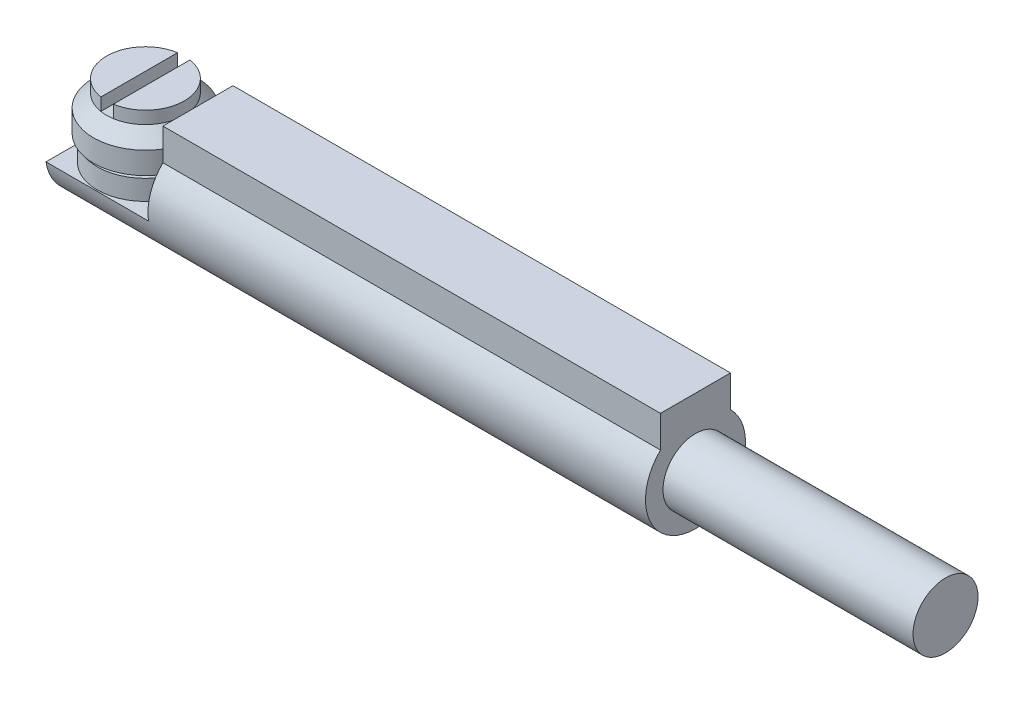
ISO-10303-21;
HEADER;
FILE_DESCRIPTION(('STEP AP214'),'2;1');
FILE_NAME('part.step','',(''),(''),'','','');
FILE_SCHEMA(('AUTOMOTIVE_DESIGN { 1 0 10303 214 1 1 1 1 }'));
ENDSEC;
DATA;
#1=APPLICATION_CONTEXT('core data for automotive mechanical design processes');
#2=APPLICATION_PROTOCOL_DEFINITION('international standard','automotive_design',2000,#1);
#3=PRODUCT_CONTEXT('',#1,'mechanical');
#4=PRODUCT('Part','Part','',(#3));
#5=PRODUCT_RELATED_PRODUCT_CATEGORY('part','',(#4));
#6=PRODUCT_DEFINITION_FORMATION('','',#4);
#7=PRODUCT_DEFINITION_CONTEXT('part definition',#1,'design');
#8=PRODUCT_DEFINITION('design','',#6,#7);
#9=PRODUCT_DEFINITION_SHAPE('','',#8);
#10=(LENGTH_UNIT() NAMED_UNIT(*) SI_UNIT(.MILLI.,.METRE.));
#11=(NAMED_UNIT(*) PLANE_ANGLE_UNIT() SI_UNIT($,.RADIAN.));
#12=(NAMED_UNIT(*) SI_UNIT($,.STERADIAN.) SOLID_ANGLE_UNIT());
#13=UNCERTAINTY_MEASURE_WITH_UNIT(LENGTH_MEASURE(1.E-05),#10,'distance_accuracy_value','');
#14=(GEOMETRIC_REPRESENTATION_CONTEXT(3) GLOBAL_UNCERTAINTY_ASSIGNED_CONTEXT((#13)) GLOBAL_UNIT_ASSIGNED_CONTEXT((#10,
#11,#12)) REPRESENTATION_CONTEXT('',''));
#15=CARTESIAN_POINT('',(0.,0.,0.));
#16=DIRECTION('',(0.,0.,1.));
#17=DIRECTION('',(1.,0.,0.));
#18=AXIS2_PLACEMENT_3D('',#15,#16,#17);
#19=CARTESIAN_POINT('',(24.,0.,0.));
#20=DIRECTION('',(1.,0.,0.));
#21=DIRECTION('',(0.,0.,-1.));
#22=AXIS2_PLACEMENT_3D('',#19,#20,#21);
#23=PLANE('',#22);
#24=CARTESIAN_POINT('',(24.,0.,0.));
#25=DIRECTION('',(1.,0.,0.));
#26=DIRECTION('',(0.,0.,-1.));
#27=AXIS2_PLACEMENT_3D('',#24,#25,#26);
#28=CIRCLE('',#27,2.);
#29=CARTESIAN_POINT('',(24.,1.42828568570857,1.4));
#30=VERTEX_POINT('',#29);
#31=CARTESIAN_POINT('',(24.,1.42828568570857,-1.4));
#32=VERTEX_POINT('',#31);
#33=EDGE_CURVE('E160',#30,#32,#28,.T.);
#34=ORIENTED_EDGE('',*,*,#33,.T.);
#35=DIRECTION('',(0.,1.,0.));
#36=VECTOR('',#35,1.);
#37=CARTESIAN_POINT('',(24.,2.7,-1.4));
#38=LINE('',#37,#36);
#39=CARTESIAN_POINT('',(24.,2.7,-1.4));
#40=VERTEX_POINT('',#39);
#41=EDGE_CURVE('E163',#32,#40,#38,.T.);
#42=ORIENTED_EDGE('',*,*,#41,.T.);
#43=DIRECTION('',(0.,0.,1.));
#44=VECTOR('',#43,1.);
#45=CARTESIAN_POINT('',(24.,2.7,1.4));
#46=LINE('',#45,#44);
#47=CARTESIAN_POINT('',(24.,2.7,1.4));
#48=VERTEX_POINT('',#47);
#49=EDGE_CURVE('E166',#40,#48,#46,.T.);
#50=ORIENTED_EDGE('',*,*,#49,.T.);
#51=DIRECTION('',(0.,-1.,0.));
#52=VECTOR('',#51,1.);
#53=CARTESIAN_POINT('',(24.,2.7,1.4));
#54=LINE('',#53,#52);
#55=EDGE_CURVE('E168',#48,#30,#54,.T.);
#56=ORIENTED_EDGE('',*,*,#55,.T.);
#57=EDGE_LOOP('',(#34,#42,#50,#56));
#58=FACE_BOUND('',#57,.T.);
#59=CARTESIAN_POINT('',(24.,0.,0.));
#60=DIRECTION('',(1.,0.,0.));
#61=DIRECTION('',(0.,0.,-1.));
#62=AXIS2_PLACEMENT_3D('',#59,#60,#61);
#63=CIRCLE('',#62,1.3);
#64=CARTESIAN_POINT('',(24.,0.,-1.3));
#65=VERTEX_POINT('',#64);
#66=EDGE_CURVE('E293',#65,#65,#63,.T.);
#67=ORIENTED_EDGE('',*,*,#66,.F.);
#68=EDGE_LOOP('',(#67));
#69=FACE_BOUND('',#68,.T.);
#70=ADVANCED_FACE('F32',(#58,#69),#23,.T.);
#71=CARTESIAN_POINT('',(2.,2.59999899999999,0.));
#72=DIRECTION('',(0.,1.,0.));
#73=DIRECTION('',(-1.,0.,0.));
#74=AXIS2_PLACEMENT_3D('',#71,#72,#73);
#75=PLANE('',#74);
#76=DIRECTION('',(0.,0.,-1.));
#77=VECTOR('',#76,1.);
#78=CARTESIAN_POINT('',(2.25,2.59999899999999,-2.5));
#79=LINE('',#78,#77);
#80=CARTESIAN_POINT('',(2.25,2.59999899999999,1.53477197003333));
#81=VERTEX_POINT('',#80);
#82=CARTESIAN_POINT('',(2.25,2.59999899999999,-1.53477197003333));
#83=VERTEX_POINT('',#82);
#84=EDGE_CURVE('E292',#81,#83,#79,.T.);
#85=ORIENTED_EDGE('',*,*,#84,.F.);
#86=CARTESIAN_POINT('',(2.,2.59999899999999,0.));
#87=DIRECTION('',(0.,1.,0.));
#88=DIRECTION('',(-1.,0.,0.));
#89=AXIS2_PLACEMENT_3D('',#86,#87,#88);
#90=CIRCLE('',#89,1.555);
#91=EDGE_CURVE('E135',#81,#83,#90,.T.);
#92=ORIENTED_EDGE('',*,*,#91,.T.);
#93=EDGE_LOOP('',(#85,#92));
#94=FACE_BOUND('',#93,.T.);
#95=ADVANCED_FACE('F216',(#94),#75,.T.);
#96=CARTESIAN_POINT('',(2.,2.59999899999999,0.));
#97=DIRECTION('',(0.,1.,0.));
#98=DIRECTION('',(-1.,0.,0.));
#99=AXIS2_PLACEMENT_3D('',#96,#97,#98);
#100=CYLINDRICAL_SURFACE('',#99,1.555);
#101=DIRECTION('',(0.,1.,0.));
#102=VECTOR('',#101,1.);
#103=CARTESIAN_POINT('',(2.25,2.59999899999999,-1.53477197003333));
#104=LINE('',#103,#102);
#105=CARTESIAN_POINT('',(2.25,2.09999899999999,-1.53477197003333));
#106=VERTEX_POINT('',#105);
#107=EDGE_CURVE('E127',#83,#106,#104,.F.);
#108=ORIENTED_EDGE('',*,*,#107,.F.);
#109=ORIENTED_EDGE('',*,*,#91,.F.);
#110=DIRECTION('',(0.,1.,0.));
#111=VECTOR('',#110,1.);
#112=CARTESIAN_POINT('',(2.25,2.59999899999999,1.53477197003333));
#113=LINE('',#112,#111);
#114=CARTESIAN_POINT('',(2.25,2.09999899999999,1.53477197003333));
#115=VERTEX_POINT('',#114);
#116=EDGE_CURVE('E124',#115,#81,#113,.T.);
#117=ORIENTED_EDGE('',*,*,#116,.F.);
#118=CARTESIAN_POINT('',(2.,2.09999899999999,0.));
#119=DIRECTION('',(0.,1.,0.));
#120=DIRECTION('',(-1.,0.,0.));
#121=AXIS2_PLACEMENT_3D('',#118,#119,#120);
#122=CIRCLE('',#121,1.555);
#123=EDGE_CURVE('E118',#115,#106,#122,.T.);
#124=ORIENTED_EDGE('',*,*,#123,.T.);
#125=EDGE_LOOP('',(#108,#109,#117,#124));
#126=FACE_BOUND('',#125,.T.);
#127=ADVANCED_FACE('F133',(#126),#100,.T.);
#128=CARTESIAN_POINT('',(0.,0.,0.));
#129=DIRECTION('',(1.,0.,0.));
#130=DIRECTION('',(0.,0.,-1.));
#131=AXIS2_PLACEMENT_3D('',#128,#129,#130);
#132=PLANE('',#131);
#133=DIRECTION('',(0.,0.,1.));
#134=VECTOR('',#133,1.);
#135=CARTESIAN_POINT('',(0.,-0.3,0.));
#136=LINE('',#135,#134);
#137=CARTESIAN_POINT('',(0.,-0.3,-1.97737199332852));
#138=VERTEX_POINT('',#137);
#139=CARTESIAN_POINT('',(0.,-0.3,1.97737199332852));
#140=VERTEX_POINT('',#139);
#141=EDGE_CURVE('E184',#138,#140,#136,.T.);
#142=ORIENTED_EDGE('',*,*,#141,.F.);
#143=CARTESIAN_POINT('',(0.,0.,0.));
#144=DIRECTION('',(1.,0.,0.));
#145=DIRECTION('',(0.,0.,-1.));
#146=AXIS2_PLACEMENT_3D('',#143,#144,#145);
#147=CIRCLE('',#146,2.);
#148=EDGE_CURVE('E164',#140,#138,#147,.T.);
#149=ORIENTED_EDGE('',*,*,#148,.F.);
#150=EDGE_LOOP('',(#142,#149));
#151=FACE_BOUND('',#150,.T.);
#152=ADVANCED_FACE('F214',(#151),#132,.F.);
#153=CARTESIAN_POINT('',(24.,0.,0.));
#154=DIRECTION('',(-1.,0.,0.));
#155=DIRECTION('',(0.,0.,1.));
#156=AXIS2_PLACEMENT_3D('',#153,#154,#155);
#157=CYLINDRICAL_SURFACE('',#156,2.);
#158=DIRECTION('',(-1.,0.,0.));
#159=VECTOR('',#158,1.);
#160=CARTESIAN_POINT('',(24.,-0.3,-1.97737199332852));
#161=LINE('',#160,#159);
#162=CARTESIAN_POINT('',(4.1,-0.3,-1.97737199332852));
#163=VERTEX_POINT('',#162);
#164=EDGE_CURVE('E55',#163,#138,#161,.T.);
#165=ORIENTED_EDGE('',*,*,#164,.F.);
#166=CARTESIAN_POINT('',(4.1,0.,0.));
#167=DIRECTION('',(1.,0.,0.));
#168=DIRECTION('',(0.,0.,-1.));
#169=AXIS2_PLACEMENT_3D('',#166,#167,#168);
#170=CIRCLE('',#169,2.);
#171=CARTESIAN_POINT('',(4.1,1.42828568570857,-1.4));
#172=VERTEX_POINT('',#171);
#173=EDGE_CURVE('E157',#163,#172,#170,.T.);
#174=ORIENTED_EDGE('',*,*,#173,.T.);
#175=DIRECTION('',(-1.,0.,0.));
#176=VECTOR('',#175,1.);
#177=CARTESIAN_POINT('',(24.,1.42828568570857,-1.4));
#178=LINE('',#177,#176);
#179=EDGE_CURVE('E181',#32,#172,#178,.T.);
#180=ORIENTED_EDGE('',*,*,#179,.F.);
#181=ORIENTED_EDGE('',*,*,#33,.F.);
#182=DIRECTION('',(-1.,0.,0.));
#183=VECTOR('',#182,1.);
#184=CARTESIAN_POINT('',(24.,1.42828568570857,1.4));
#185=LINE('',#184,#183);
#186=CARTESIAN_POINT('',(4.1,1.42828568570857,1.4));
#187=VERTEX_POINT('',#186);
#188=EDGE_CURVE('E170',#30,#187,#185,.T.);
#189=ORIENTED_EDGE('',*,*,#188,.T.);
#190=CARTESIAN_POINT('',(4.1,-0.3,1.97737199332852));
#191=VERTEX_POINT('',#190);
#192=EDGE_CURVE('E153',#187,#191,#170,.T.);
#193=ORIENTED_EDGE('',*,*,#192,.T.);
#194=DIRECTION('',(-1.,0.,0.));
#195=VECTOR('',#194,1.);
#196=CARTESIAN_POINT('',(24.,-0.3,1.97737199332852));
#197=LINE('',#196,#195);
#198=EDGE_CURVE('E148',#140,#191,#197,.F.);
#199=ORIENTED_EDGE('',*,*,#198,.F.);
#200=ORIENTED_EDGE('',*,*,#148,.T.);
#201=EDGE_LOOP('',(#165,#174,#180,#181,#189,#193,#199,#200));
#202=FACE_BOUND('',#201,.T.);
#203=ADVANCED_FACE('F34',(#202),#157,.T.);
#204=CARTESIAN_POINT('',(24.,2.7,-1.4));
#205=DIRECTION('',(0.,0.,1.));
#206=DIRECTION('',(0.,-1.,0.));
#207=AXIS2_PLACEMENT_3D('',#204,#205,#206);
#208=PLANE('',#207);
#209=ORIENTED_EDGE('',*,*,#179,.T.);
#210=DIRECTION('',(0.,1.,0.));
#211=VECTOR('',#210,1.);
#212=CARTESIAN_POINT('',(4.1,2.7,-1.4));
#213=LINE('',#212,#211);
#214=CARTESIAN_POINT('',(4.1,2.7,-1.4));
#215=VERTEX_POINT('',#214);
#216=EDGE_CURVE('E156',#172,#215,#213,.T.);
#217=ORIENTED_EDGE('',*,*,#216,.T.);
#218=DIRECTION('',(-1.,0.,0.));
#219=VECTOR('',#218,1.);
#220=CARTESIAN_POINT('',(24.,2.7,-1.4));
#221=LINE('',#220,#219);
#222=EDGE_CURVE('E178',#40,#215,#221,.T.);
#223=ORIENTED_EDGE('',*,*,#222,.F.);
#224=ORIENTED_EDGE('',*,*,#41,.F.);
#225=EDGE_LOOP('',(#209,#217,#223,#224));
#226=FACE_BOUND('',#225,.T.);
#227=ADVANCED_FACE('F207',(#226),#208,.F.);
#228=CARTESIAN_POINT('',(24.,2.7,1.4));
#229=DIRECTION('',(0.,-1.,0.));
#230=DIRECTION('',(0.,0.,-1.));
#231=AXIS2_PLACEMENT_3D('',#228,#229,#230);
#232=PLANE('',#231);
#233=ORIENTED_EDGE('',*,*,#222,.T.);
#234=DIRECTION('',(0.,0.,-1.));
#235=VECTOR('',#234,1.);
#236=CARTESIAN_POINT('',(4.1,2.7,-2.5));
#237=LINE('',#236,#235);
#238=CARTESIAN_POINT('',(4.1,2.7,1.4));
#239=VERTEX_POINT('',#238);
#240=EDGE_CURVE('E149',#239,#215,#237,.T.);
#241=ORIENTED_EDGE('',*,*,#240,.F.);
#242=DIRECTION('',(-1.,0.,0.));
#243=VECTOR('',#242,1.);
#244=CARTESIAN_POINT('',(24.,2.7,1.4));
#245=LINE('',#244,#243);
#246=EDGE_CURVE('E175',#48,#239,#245,.T.);
#247=ORIENTED_EDGE('',*,*,#246,.F.);
#248=ORIENTED_EDGE('',*,*,#49,.F.);
#249=EDGE_LOOP('',(#233,#241,#247,#248));
#250=FACE_BOUND('',#249,.T.);
#251=ADVANCED_FACE('F203',(#250),#232,.F.);
#252=CARTESIAN_POINT('',(24.,2.7,1.4));
#253=DIRECTION('',(0.,0.,-1.));
#254=DIRECTION('',(0.,1.,0.));
#255=AXIS2_PLACEMENT_3D('',#252,#253,#254);
#256=PLANE('',#255);
#257=ORIENTED_EDGE('',*,*,#246,.T.);
#258=DIRECTION('',(0.,-1.,0.));
#259=VECTOR('',#258,1.);
#260=CARTESIAN_POINT('',(4.1,2.7,1.4));
#261=LINE('',#260,#259);
#262=EDGE_CURVE('E40',#239,#187,#261,.T.);
#263=ORIENTED_EDGE('',*,*,#262,.T.);
#264=ORIENTED_EDGE('',*,*,#188,.F.);
#265=ORIENTED_EDGE('',*,*,#55,.F.);
#266=EDGE_LOOP('',(#257,#263,#264,#265));
#267=FACE_BOUND('',#266,.T.);
#268=ADVANCED_FACE('F188',(#267),#256,.F.);
#269=CARTESIAN_POINT('',(4.1,-0.3,-2.5));
#270=DIRECTION('',(1.,0.,0.));
#271=DIRECTION('',(0.,0.,-1.));
#272=AXIS2_PLACEMENT_3D('',#269,#270,#271);
#273=PLANE('',#272);
#274=DIRECTION('',(0.,0.,-1.));
#275=VECTOR('',#274,1.);
#276=CARTESIAN_POINT('',(4.1,-0.3,-2.5));
#277=LINE('',#276,#275);
#278=EDGE_CURVE('E146',#191,#163,#277,.T.);
#279=ORIENTED_EDGE('',*,*,#278,.F.);
#280=ORIENTED_EDGE('',*,*,#192,.F.);
#281=ORIENTED_EDGE('',*,*,#262,.F.);
#282=ORIENTED_EDGE('',*,*,#240,.T.);
#283=ORIENTED_EDGE('',*,*,#216,.F.);
#284=ORIENTED_EDGE('',*,*,#173,.F.);
#285=EDGE_LOOP('',(#279,#280,#281,#282,#283,#284));
#286=FACE_BOUND('',#285,.T.);
#287=ADVANCED_FACE('F205',(#286),#273,.F.);
#288=CARTESIAN_POINT('',(4.1,-0.3,2.5));
#289=DIRECTION('',(0.,1.,0.));
#290=DIRECTION('',(0.,0.,1.));
#291=AXIS2_PLACEMENT_3D('',#288,#289,#290);
#292=PLANE('',#291);
#293=CARTESIAN_POINT('',(2.,-0.3,0.));
#294=DIRECTION('',(0.,1.,0.));
#295=DIRECTION('',(0.,0.,1.));
#296=AXIS2_PLACEMENT_3D('',#293,#294,#295);
#297=CIRCLE('',#296,1.9250009999999);
#298=CARTESIAN_POINT('',(2.,-0.3,1.9250009999999));
#299=VERTEX_POINT('',#298);
#300=EDGE_CURVE('E11',#299,#299,#297,.T.);
#301=ORIENTED_EDGE('',*,*,#300,.F.);
#302=EDGE_LOOP('',(#301));
#303=FACE_BOUND('',#302,.T.);
#304=ORIENTED_EDGE('',*,*,#164,.T.);
#305=ORIENTED_EDGE('',*,*,#141,.T.);
#306=ORIENTED_EDGE('',*,*,#198,.T.);
#307=ORIENTED_EDGE('',*,*,#278,.T.);
#308=EDGE_LOOP('',(#304,#305,#306,#307));
#309=FACE_BOUND('',#308,.T.);
#310=ADVANCED_FACE('F234',(#303,#309),#292,.T.);
#311=DIRECTION('',(0.,0.,1.));
#312=VECTOR('',#311,1.);
#313=CARTESIAN_POINT('',(1.75,2.59999899999999,-2.5));
#314=LINE('',#313,#312);
#315=CARTESIAN_POINT('',(1.75,2.59999899999999,-1.53477197003333));
#316=VERTEX_POINT('',#315);
#317=CARTESIAN_POINT('',(1.75,2.59999899999999,1.53477197003333));
#318=VERTEX_POINT('',#317);
#319=EDGE_CURVE('E128',#316,#318,#314,.T.);
#320=ORIENTED_EDGE('',*,*,#319,.F.);
#321=EDGE_CURVE('E117',#316,#318,#90,.T.);
#322=ORIENTED_EDGE('',*,*,#321,.T.);
#323=EDGE_LOOP('',(#320,#322));
#324=FACE_BOUND('',#323,.T.);
#325=ADVANCED_FACE('F223',(#324),#75,.T.);
#326=DIRECTION('',(0.,1.,0.));
#327=VECTOR('',#326,1.);
#328=CARTESIAN_POINT('',(1.75,2.59999899999999,1.53477197003333));
#329=LINE('',#328,#327);
#330=CARTESIAN_POINT('',(1.75,2.09999899999999,1.53477197003333));
#331=VERTEX_POINT('',#330);
#332=EDGE_CURVE('E136',#318,#331,#329,.F.);
#333=ORIENTED_EDGE('',*,*,#332,.F.);
#334=ORIENTED_EDGE('',*,*,#321,.F.);
#335=DIRECTION('',(0.,1.,0.));
#336=VECTOR('',#335,1.);
#337=CARTESIAN_POINT('',(1.75,2.59999899999999,-1.53477197003333));
#338=LINE('',#337,#336);
#339=CARTESIAN_POINT('',(1.75,2.09999899999999,-1.53477197003333));
#340=VERTEX_POINT('',#339);
#341=EDGE_CURVE('E299',#340,#316,#338,.T.);
#342=ORIENTED_EDGE('',*,*,#341,.F.);
#343=EDGE_CURVE('E120',#340,#331,#122,.T.);
#344=ORIENTED_EDGE('',*,*,#343,.T.);
#345=EDGE_LOOP('',(#333,#334,#342,#344));
#346=FACE_BOUND('',#345,.T.);
#347=ADVANCED_FACE('F242',(#346),#100,.T.);
#348=CARTESIAN_POINT('',(2.,2.09999899999999,0.));
#349=DIRECTION('',(0.,-1.,0.));
#350=DIRECTION('',(1.,0.,0.));
#351=AXIS2_PLACEMENT_3D('',#348,#349,#350);
#352=CONICAL_SURFACE('',#351,1.555,0.785403932606065);
#353=CARTESIAN_POINT('',(2.,1.58000000000002,0.));
#354=DIRECTION('',(0.,1.,0.));
#355=DIRECTION('',(-1.,0.,0.));
#356=AXIS2_PLACEMENT_3D('',#353,#354,#355);
#357=CIRCLE('',#356,2.075005);
#358=CARTESIAN_POINT('',(-0.0750050000000043,1.58000000000002,0.));
#359=VERTEX_POINT('',#358);
#360=EDGE_CURVE('E142',#359,#359,#357,.T.);
#361=ORIENTED_EDGE('',*,*,#360,.T.);
#362=EDGE_LOOP('',(#361));
#363=FACE_BOUND('',#362,.T.);
#364=EDGE_CURVE('E109',#331,#115,#122,.T.);
#365=ORIENTED_EDGE('',*,*,#364,.F.);
#366=ORIENTED_EDGE('',*,*,#343,.F.);
#367=EDGE_CURVE('E139',#106,#340,#122,.T.);
#368=ORIENTED_EDGE('',*,*,#367,.F.);
#369=ORIENTED_EDGE('',*,*,#123,.F.);
#370=EDGE_LOOP('',(#365,#366,#368,#369));
#371=FACE_BOUND('',#370,.T.);
#372=ADVANCED_FACE('F138',(#363,#371),#352,.T.);
#373=CARTESIAN_POINT('',(2.,2.59999899999999,0.));
#374=DIRECTION('',(0.,1.,0.));
#375=DIRECTION('',(-1.,0.,0.));
#376=AXIS2_PLACEMENT_3D('',#373,#374,#375);
#377=CYLINDRICAL_SURFACE('',#376,2.075005);
#378=CARTESIAN_POINT('',(2.,0.700000000000008,0.));
#379=DIRECTION('',(0.,1.,0.));
#380=DIRECTION('',(-1.,0.,0.));
#381=AXIS2_PLACEMENT_3D('',#378,#379,#380);
#382=CIRCLE('',#381,2.075005);
#383=CARTESIAN_POINT('',(-0.0750050000000038,0.700000000000008,0.));
#384=VERTEX_POINT('',#383);
#385=EDGE_CURVE('E313',#384,#384,#382,.T.);
#386=ORIENTED_EDGE('',*,*,#385,.T.);
#387=EDGE_LOOP('',(#386));
#388=FACE_BOUND('',#387,.T.);
#389=ORIENTED_EDGE('',*,*,#360,.F.);
#390=EDGE_LOOP('',(#389));
#391=FACE_BOUND('',#390,.T.);
#392=ADVANCED_FACE('F251',(#388,#391),#377,.T.);
#393=CARTESIAN_POINT('',(1.22499799999999,0.700000000000008,0.));
#394=DIRECTION('',(0.,-1.,0.));
#395=DIRECTION('',(1.,0.,0.));
#396=AXIS2_PLACEMENT_3D('',#393,#394,#395);
#397=PLANE('',#396);
#398=CARTESIAN_POINT('',(2.,0.700000000000008,0.));
#399=DIRECTION('',(0.,1.,0.));
#400=DIRECTION('',(-1.,0.,0.));
#401=AXIS2_PLACEMENT_3D('',#398,#399,#400);
#402=CIRCLE('',#401,0.77500200000001);
#403=CARTESIAN_POINT('',(1.22499799999999,0.700000000000008,0.));
#404=VERTEX_POINT('',#403);
#405=EDGE_CURVE('E311',#404,#404,#402,.T.);
#406=ORIENTED_EDGE('',*,*,#405,.T.);
#407=EDGE_LOOP('',(#406));
#408=FACE_BOUND('',#407,.T.);
#409=ORIENTED_EDGE('',*,*,#385,.F.);
#410=EDGE_LOOP('',(#409));
#411=FACE_BOUND('',#410,.T.);
#412=ADVANCED_FACE('F255',(#408,#411),#397,.T.);
#413=CARTESIAN_POINT('',(2.,2.59999899999999,0.));
#414=DIRECTION('',(0.,1.,0.));
#415=DIRECTION('',(-1.,0.,0.));
#416=AXIS2_PLACEMENT_3D('',#413,#414,#415);
#417=CYLINDRICAL_SURFACE('',#416,0.77500200000001);
#418=CARTESIAN_POINT('',(2.,0.499997999999996,0.));
#419=DIRECTION('',(0.,1.,0.));
#420=DIRECTION('',(-1.,0.,0.));
#421=AXIS2_PLACEMENT_3D('',#418,#419,#420);
#422=CIRCLE('',#421,0.77500200000001);
#423=CARTESIAN_POINT('',(1.22499799999999,0.499997999999996,0.));
#424=VERTEX_POINT('',#423);
#425=EDGE_CURVE('E308',#424,#424,#422,.T.);
#426=ORIENTED_EDGE('',*,*,#425,.T.);
#427=EDGE_LOOP('',(#426));
#428=FACE_BOUND('',#427,.T.);
#429=ORIENTED_EDGE('',*,*,#405,.F.);
#430=EDGE_LOOP('',(#429));
#431=FACE_BOUND('',#430,.T.);
#432=ADVANCED_FACE('F259',(#428,#431),#417,.T.);
#433=CARTESIAN_POINT('',(0.0749990000001023,0.499997999999996,0.));
#434=DIRECTION('',(0.,1.,0.));
#435=DIRECTION('',(-1.,0.,0.));
#436=AXIS2_PLACEMENT_3D('',#433,#434,#435);
#437=PLANE('',#436);
#438=CARTESIAN_POINT('',(2.,0.499997999999997,0.));
#439=DIRECTION('',(0.,1.,0.));
#440=DIRECTION('',(-1.,0.,0.));
#441=AXIS2_PLACEMENT_3D('',#438,#439,#440);
#442=CIRCLE('',#441,1.9250009999999);
#443=CARTESIAN_POINT('',(0.0749990000001024,0.499997999999996,0.));
#444=VERTEX_POINT('',#443);
#445=EDGE_CURVE('E305',#444,#444,#442,.T.);
#446=ORIENTED_EDGE('',*,*,#445,.T.);
#447=EDGE_LOOP('',(#446));
#448=FACE_BOUND('',#447,.T.);
#449=ORIENTED_EDGE('',*,*,#425,.F.);
#450=EDGE_LOOP('',(#449));
#451=FACE_BOUND('',#450,.T.);
#452=ADVANCED_FACE('F263',(#448,#451),#437,.T.);
#453=CARTESIAN_POINT('',(2.,2.59999899999999,0.));
#454=DIRECTION('',(0.,1.,0.));
#455=DIRECTION('',(-1.,0.,0.));
#456=AXIS2_PLACEMENT_3D('',#453,#454,#455);
#457=CYLINDRICAL_SURFACE('',#456,1.9250009999999);
#458=ORIENTED_EDGE('',*,*,#300,.T.);
#459=EDGE_LOOP('',(#458));
#460=FACE_BOUND('',#459,.T.);
#461=ORIENTED_EDGE('',*,*,#445,.F.);
#462=EDGE_LOOP('',(#461));
#463=FACE_BOUND('',#462,.T.);
#464=ADVANCED_FACE('F267',(#460,#463),#457,.T.);
#465=CARTESIAN_POINT('',(2.25,2.09999899999999,-2.5));
#466=DIRECTION('',(1.,0.,0.));
#467=DIRECTION('',(0.,0.,-1.));
#468=AXIS2_PLACEMENT_3D('',#465,#466,#467);
#469=PLANE('',#468);
#470=ORIENTED_EDGE('',*,*,#107,.T.);
#471=DIRECTION('',(0.,0.,-1.));
#472=VECTOR('',#471,1.);
#473=CARTESIAN_POINT('',(2.25,2.09999899999999,-2.5));
#474=LINE('',#473,#472);
#475=EDGE_CURVE('E112',#115,#106,#474,.T.);
#476=ORIENTED_EDGE('',*,*,#475,.F.);
#477=ORIENTED_EDGE('',*,*,#116,.T.);
#478=ORIENTED_EDGE('',*,*,#84,.T.);
#479=EDGE_LOOP('',(#470,#476,#477,#478));
#480=FACE_BOUND('',#479,.T.);
#481=ADVANCED_FACE('F123',(#480),#469,.F.);
#482=CARTESIAN_POINT('',(1.75,2.09999899999999,-2.5));
#483=DIRECTION('',(-1.,0.,0.));
#484=DIRECTION('',(0.,-1.,0.));
#485=AXIS2_PLACEMENT_3D('',#482,#483,#484);
#486=PLANE('',#485);
#487=ORIENTED_EDGE('',*,*,#332,.T.);
#488=DIRECTION('',(0.,0.,1.));
#489=VECTOR('',#488,1.);
#490=CARTESIAN_POINT('',(1.75,2.09999899999999,-2.5));
#491=LINE('',#490,#489);
#492=EDGE_CURVE('E47',#340,#331,#491,.T.);
#493=ORIENTED_EDGE('',*,*,#492,.F.);
#494=ORIENTED_EDGE('',*,*,#341,.T.);
#495=ORIENTED_EDGE('',*,*,#319,.T.);
#496=EDGE_LOOP('',(#487,#493,#494,#495));
#497=FACE_BOUND('',#496,.T.);
#498=ADVANCED_FACE('F274',(#497),#486,.F.);
#499=CARTESIAN_POINT('',(2.25,2.09999899999999,2.5));
#500=DIRECTION('',(0.,1.,0.));
#501=DIRECTION('',(0.,0.,1.));
#502=AXIS2_PLACEMENT_3D('',#499,#500,#501);
#503=PLANE('',#502);
#504=ORIENTED_EDGE('',*,*,#492,.T.);
#505=ORIENTED_EDGE('',*,*,#364,.T.);
#506=ORIENTED_EDGE('',*,*,#475,.T.);
#507=ORIENTED_EDGE('',*,*,#367,.T.);
#508=EDGE_LOOP('',(#504,#505,#506,#507));
#509=FACE_BOUND('',#508,.T.);
#510=ADVANCED_FACE('F111',(#509),#503,.T.);
#511=CARTESIAN_POINT('',(34.,0.,0.));
#512=DIRECTION('',(-1.,0.,0.));
#513=DIRECTION('',(0.,0.,1.));
#514=AXIS2_PLACEMENT_3D('',#511,#512,#513);
#515=CYLINDRICAL_SURFACE('',#514,1.3);
#516=CARTESIAN_POINT('',(34.,0.,0.));
#517=DIRECTION('',(1.,0.,0.));
#518=DIRECTION('',(0.,0.,-1.));
#519=AXIS2_PLACEMENT_3D('',#516,#517,#518);
#520=CIRCLE('',#519,1.3);
#521=CARTESIAN_POINT('',(34.,0.,-1.3));
#522=VERTEX_POINT('',#521);
#523=EDGE_CURVE('E291',#522,#522,#520,.T.);
#524=ORIENTED_EDGE('',*,*,#523,.F.);
#525=EDGE_LOOP('',(#524));
#526=FACE_BOUND('',#525,.T.);
#527=ORIENTED_EDGE('',*,*,#66,.T.);
#528=EDGE_LOOP('',(#527));
#529=FACE_BOUND('',#528,.T.);
#530=ADVANCED_FACE('F280',(#526,#529),#515,.T.);
#531=CARTESIAN_POINT('',(34.,0.,0.));
#532=DIRECTION('',(1.,0.,0.));
#533=DIRECTION('',(0.,0.,-1.));
#534=AXIS2_PLACEMENT_3D('',#531,#532,#533);
#535=PLANE('',#534);
#536=ORIENTED_EDGE('',*,*,#523,.T.);
#537=EDGE_LOOP('',(#536));
#538=FACE_BOUND('',#537,.T.);
#539=ADVANCED_FACE('F283',(#538),#535,.T.);
#540=CLOSED_SHELL('',(#70,#95,#127,#152,#203,#227,#251,#268,#287,#310,#325,#347,#372,#392,#412,
#432,#452,#464,#481,#498,#510,#530,#539));
#541=MANIFOLD_SOLID_BREP('B2',#540);
#542=ADVANCED_BREP_SHAPE_REPRESENTATION('',(#18,#541),#14);
#543=SHAPE_DEFINITION_REPRESENTATION(#9,#542);
ENDSEC;
END-ISO-10303-21;
